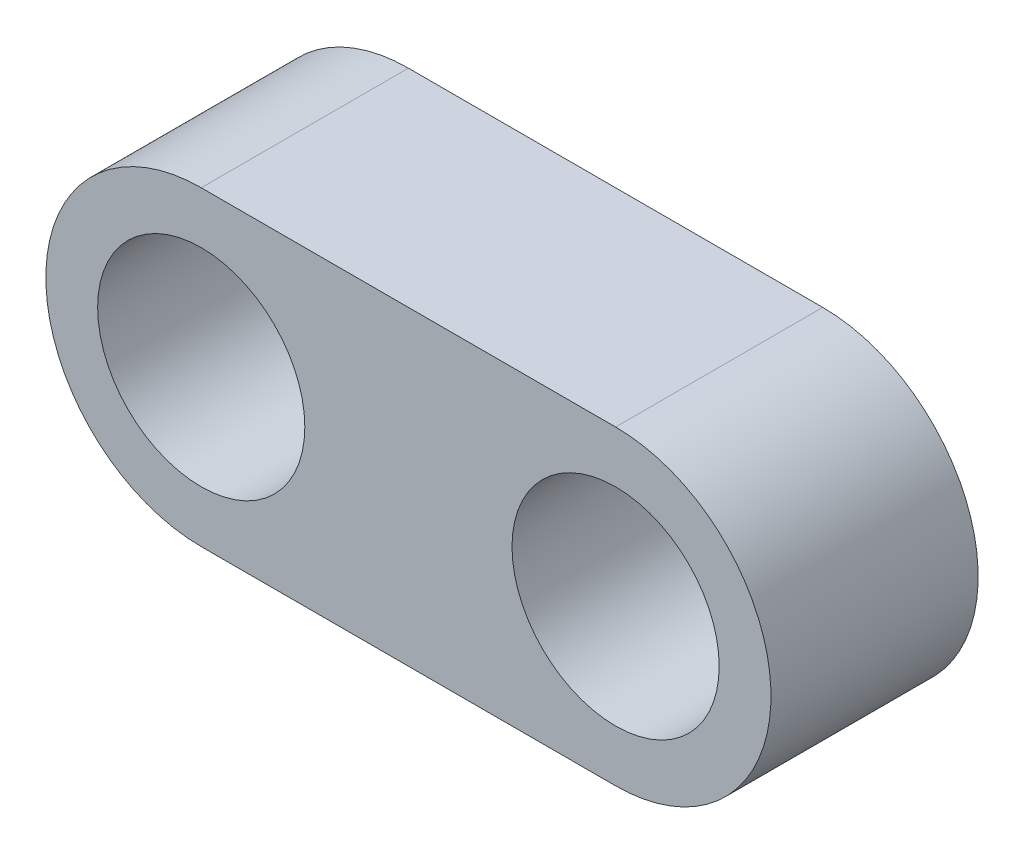
ISO-10303-21;
HEADER;
FILE_DESCRIPTION(('STEP AP214'),'2;1');
FILE_NAME('part.step','',(''),(''),'','','');
FILE_SCHEMA(('AUTOMOTIVE_DESIGN { 1 0 10303 214 1 1 1 1 }'));
ENDSEC;
DATA;
#1=APPLICATION_CONTEXT('core data for automotive mechanical design processes');
#2=APPLICATION_PROTOCOL_DEFINITION('international standard','automotive_design',2000,#1);
#3=PRODUCT_CONTEXT('',#1,'mechanical');
#4=PRODUCT('Part','Part','',(#3));
#5=PRODUCT_RELATED_PRODUCT_CATEGORY('part','',(#4));
#6=PRODUCT_DEFINITION_FORMATION('','',#4);
#7=PRODUCT_DEFINITION_CONTEXT('part definition',#1,'design');
#8=PRODUCT_DEFINITION('design','',#6,#7);
#9=PRODUCT_DEFINITION_SHAPE('','',#8);
#10=(LENGTH_UNIT() NAMED_UNIT(*) SI_UNIT(.MILLI.,.METRE.));
#11=(NAMED_UNIT(*) PLANE_ANGLE_UNIT() SI_UNIT($,.RADIAN.));
#12=(NAMED_UNIT(*) SI_UNIT($,.STERADIAN.) SOLID_ANGLE_UNIT());
#13=UNCERTAINTY_MEASURE_WITH_UNIT(LENGTH_MEASURE(1.E-05),#10,'distance_accuracy_value','');
#14=(GEOMETRIC_REPRESENTATION_CONTEXT(3) GLOBAL_UNCERTAINTY_ASSIGNED_CONTEXT((#13)) GLOBAL_UNIT_ASSIGNED_CONTEXT((#10,
#11,#12)) REPRESENTATION_CONTEXT('',''));
#15=CARTESIAN_POINT('',(0.,0.,0.));
#16=DIRECTION('',(0.,0.,1.));
#17=DIRECTION('',(1.,0.,0.));
#18=AXIS2_PLACEMENT_3D('',#15,#16,#17);
#19=CARTESIAN_POINT('',(-2.,0.,2.));
#20=DIRECTION('',(0.,0.,-1.));
#21=DIRECTION('',(-1.,0.,0.));
#22=AXIS2_PLACEMENT_3D('',#19,#20,#21);
#23=CYLINDRICAL_SURFACE('',#22,1.5);
#24=CARTESIAN_POINT('',(-2.,0.,0.));
#25=DIRECTION('',(0.,0.,1.));
#26=DIRECTION('',(1.,0.,0.));
#27=AXIS2_PLACEMENT_3D('',#24,#25,#26);
#28=CIRCLE('',#27,1.5);
#29=CARTESIAN_POINT('',(-2.,1.5,0.));
#30=VERTEX_POINT('',#29);
#31=CARTESIAN_POINT('',(-2.,-1.5,0.));
#32=VERTEX_POINT('',#31);
#33=EDGE_CURVE('E106',#30,#32,#28,.T.);
#34=ORIENTED_EDGE('',*,*,#33,.T.);
#35=DIRECTION('',(0.,0.,-1.));
#36=VECTOR('',#35,1.);
#37=CARTESIAN_POINT('',(-2.,-1.5,2.));
#38=LINE('',#37,#36);
#39=CARTESIAN_POINT('',(-2.,-1.5,2.));
#40=VERTEX_POINT('',#39);
#41=EDGE_CURVE('E11',#40,#32,#38,.T.);
#42=ORIENTED_EDGE('',*,*,#41,.F.);
#43=CARTESIAN_POINT('',(-2.,0.,2.));
#44=DIRECTION('',(0.,0.,1.));
#45=DIRECTION('',(1.,0.,0.));
#46=AXIS2_PLACEMENT_3D('',#43,#44,#45);
#47=CIRCLE('',#46,1.5);
#48=CARTESIAN_POINT('',(-2.,1.5,2.));
#49=VERTEX_POINT('',#48);
#50=EDGE_CURVE('E86',#49,#40,#47,.T.);
#51=ORIENTED_EDGE('',*,*,#50,.F.);
#52=DIRECTION('',(0.,0.,-1.));
#53=VECTOR('',#52,1.);
#54=CARTESIAN_POINT('',(-2.,1.5,2.));
#55=LINE('',#54,#53);
#56=EDGE_CURVE('E52',#49,#30,#55,.T.);
#57=ORIENTED_EDGE('',*,*,#56,.T.);
#58=EDGE_LOOP('',(#34,#42,#51,#57));
#59=FACE_BOUND('',#58,.T.);
#60=ADVANCED_FACE('F35',(#59),#23,.T.);
#61=CARTESIAN_POINT('',(0.,-1.5,2.));
#62=DIRECTION('',(0.,1.,0.));
#63=DIRECTION('',(0.,0.,1.));
#64=AXIS2_PLACEMENT_3D('',#61,#62,#63);
#65=PLANE('',#64);
#66=DIRECTION('',(1.,0.,0.));
#67=VECTOR('',#66,1.);
#68=CARTESIAN_POINT('',(0.,-1.5,0.));
#69=LINE('',#68,#67);
#70=CARTESIAN_POINT('',(2.,-1.5,0.));
#71=VERTEX_POINT('',#70);
#72=EDGE_CURVE('E91',#32,#71,#69,.T.);
#73=ORIENTED_EDGE('',*,*,#72,.T.);
#74=DIRECTION('',(0.,0.,-1.));
#75=VECTOR('',#74,1.);
#76=CARTESIAN_POINT('',(2.,-1.5,2.));
#77=LINE('',#76,#75);
#78=CARTESIAN_POINT('',(2.,-1.5,2.));
#79=VERTEX_POINT('',#78);
#80=EDGE_CURVE('E44',#79,#71,#77,.T.);
#81=ORIENTED_EDGE('',*,*,#80,.F.);
#82=DIRECTION('',(1.,0.,0.));
#83=VECTOR('',#82,1.);
#84=CARTESIAN_POINT('',(0.,-1.5,2.));
#85=LINE('',#84,#83);
#86=EDGE_CURVE('E78',#40,#79,#85,.T.);
#87=ORIENTED_EDGE('',*,*,#86,.F.);
#88=ORIENTED_EDGE('',*,*,#41,.T.);
#89=EDGE_LOOP('',(#73,#81,#87,#88));
#90=FACE_BOUND('',#89,.T.);
#91=ADVANCED_FACE('F90',(#90),#65,.F.);
#92=CARTESIAN_POINT('',(2.,0.,2.));
#93=DIRECTION('',(0.,0.,-1.));
#94=DIRECTION('',(-1.,0.,0.));
#95=AXIS2_PLACEMENT_3D('',#92,#93,#94);
#96=CYLINDRICAL_SURFACE('',#95,1.5);
#97=CARTESIAN_POINT('',(2.,0.,0.));
#98=DIRECTION('',(0.,0.,1.));
#99=DIRECTION('',(1.,0.,0.));
#100=AXIS2_PLACEMENT_3D('',#97,#98,#99);
#101=CIRCLE('',#100,1.5);
#102=CARTESIAN_POINT('',(2.,1.5,0.));
#103=VERTEX_POINT('',#102);
#104=EDGE_CURVE('E109',#71,#103,#101,.T.);
#105=ORIENTED_EDGE('',*,*,#104,.T.);
#106=DIRECTION('',(0.,0.,-1.));
#107=VECTOR('',#106,1.);
#108=CARTESIAN_POINT('',(2.,1.5,2.));
#109=LINE('',#108,#107);
#110=CARTESIAN_POINT('',(2.,1.5,2.));
#111=VERTEX_POINT('',#110);
#112=EDGE_CURVE('E67',#111,#103,#109,.T.);
#113=ORIENTED_EDGE('',*,*,#112,.F.);
#114=CARTESIAN_POINT('',(2.,0.,2.));
#115=DIRECTION('',(0.,0.,1.));
#116=DIRECTION('',(1.,0.,0.));
#117=AXIS2_PLACEMENT_3D('',#114,#115,#116);
#118=CIRCLE('',#117,1.5);
#119=EDGE_CURVE('E85',#79,#111,#118,.T.);
#120=ORIENTED_EDGE('',*,*,#119,.F.);
#121=ORIENTED_EDGE('',*,*,#80,.T.);
#122=EDGE_LOOP('',(#105,#113,#120,#121));
#123=FACE_BOUND('',#122,.T.);
#124=ADVANCED_FACE('F94',(#123),#96,.T.);
#125=CARTESIAN_POINT('',(0.,1.5,2.));
#126=DIRECTION('',(0.,1.,0.));
#127=DIRECTION('',(0.,0.,1.));
#128=AXIS2_PLACEMENT_3D('',#125,#126,#127);
#129=PLANE('',#128);
#130=DIRECTION('',(1.,0.,0.));
#131=VECTOR('',#130,1.);
#132=CARTESIAN_POINT('',(0.,1.5,0.));
#133=LINE('',#132,#131);
#134=EDGE_CURVE('E111',#30,#103,#133,.T.);
#135=ORIENTED_EDGE('',*,*,#134,.F.);
#136=ORIENTED_EDGE('',*,*,#56,.F.);
#137=DIRECTION('',(1.,0.,0.));
#138=VECTOR('',#137,1.);
#139=CARTESIAN_POINT('',(0.,1.5,2.));
#140=LINE('',#139,#138);
#141=EDGE_CURVE('E95',#49,#111,#140,.T.);
#142=ORIENTED_EDGE('',*,*,#141,.T.);
#143=ORIENTED_EDGE('',*,*,#112,.T.);
#144=EDGE_LOOP('',(#135,#136,#142,#143));
#145=FACE_BOUND('',#144,.T.);
#146=ADVANCED_FACE('F147',(#145),#129,.T.);
#147=CARTESIAN_POINT('',(-2.,0.,2.));
#148=DIRECTION('',(0.,0.,-1.));
#149=DIRECTION('',(-1.,0.,0.));
#150=AXIS2_PLACEMENT_3D('',#147,#148,#149);
#151=CYLINDRICAL_SURFACE('',#150,1.);
#152=CARTESIAN_POINT('',(-2.,0.,2.));
#153=DIRECTION('',(0.,0.,1.));
#154=DIRECTION('',(1.,0.,0.));
#155=AXIS2_PLACEMENT_3D('',#152,#153,#154);
#156=CIRCLE('',#155,1.);
#157=CARTESIAN_POINT('',(-1.,0.,2.));
#158=VERTEX_POINT('',#157);
#159=EDGE_CURVE('E117',#158,#158,#156,.T.);
#160=ORIENTED_EDGE('',*,*,#159,.T.);
#161=EDGE_LOOP('',(#160));
#162=FACE_BOUND('',#161,.T.);
#163=CARTESIAN_POINT('',(-2.,0.,0.));
#164=DIRECTION('',(0.,0.,1.));
#165=DIRECTION('',(1.,0.,0.));
#166=AXIS2_PLACEMENT_3D('',#163,#164,#165);
#167=CIRCLE('',#166,1.);
#168=CARTESIAN_POINT('',(-1.,0.,0.));
#169=VERTEX_POINT('',#168);
#170=EDGE_CURVE('E103',#169,#169,#167,.T.);
#171=ORIENTED_EDGE('',*,*,#170,.F.);
#172=EDGE_LOOP('',(#171));
#173=FACE_BOUND('',#172,.T.);
#174=ADVANCED_FACE('F37',(#162,#173),#151,.F.);
#175=CARTESIAN_POINT('',(2.,0.,2.));
#176=DIRECTION('',(0.,0.,-1.));
#177=DIRECTION('',(-1.,0.,0.));
#178=AXIS2_PLACEMENT_3D('',#175,#176,#177);
#179=CYLINDRICAL_SURFACE('',#178,1.);
#180=CARTESIAN_POINT('',(2.,0.,2.));
#181=DIRECTION('',(0.,0.,1.));
#182=DIRECTION('',(1.,0.,0.));
#183=AXIS2_PLACEMENT_3D('',#180,#181,#182);
#184=CIRCLE('',#183,1.);
#185=CARTESIAN_POINT('',(3.,0.,2.));
#186=VERTEX_POINT('',#185);
#187=EDGE_CURVE('E97',#186,#186,#184,.T.);
#188=ORIENTED_EDGE('',*,*,#187,.T.);
#189=EDGE_LOOP('',(#188));
#190=FACE_BOUND('',#189,.T.);
#191=CARTESIAN_POINT('',(2.,0.,0.));
#192=DIRECTION('',(0.,0.,1.));
#193=DIRECTION('',(1.,0.,0.));
#194=AXIS2_PLACEMENT_3D('',#191,#192,#193);
#195=CIRCLE('',#194,1.);
#196=CARTESIAN_POINT('',(3.,0.,0.));
#197=VERTEX_POINT('',#196);
#198=EDGE_CURVE('E114',#197,#197,#195,.T.);
#199=ORIENTED_EDGE('',*,*,#198,.F.);
#200=EDGE_LOOP('',(#199));
#201=FACE_BOUND('',#200,.T.);
#202=ADVANCED_FACE('F129',(#190,#201),#179,.F.);
#203=CARTESIAN_POINT('',(0.,0.,2.));
#204=DIRECTION('',(0.,0.,1.));
#205=DIRECTION('',(1.,0.,0.));
#206=AXIS2_PLACEMENT_3D('',#203,#204,#205);
#207=PLANE('',#206);
#208=ORIENTED_EDGE('',*,*,#159,.F.);
#209=EDGE_LOOP('',(#208));
#210=FACE_BOUND('',#209,.T.);
#211=ORIENTED_EDGE('',*,*,#50,.T.);
#212=ORIENTED_EDGE('',*,*,#86,.T.);
#213=ORIENTED_EDGE('',*,*,#119,.T.);
#214=ORIENTED_EDGE('',*,*,#141,.F.);
#215=EDGE_LOOP('',(#211,#212,#213,#214));
#216=FACE_BOUND('',#215,.T.);
#217=ORIENTED_EDGE('',*,*,#187,.F.);
#218=EDGE_LOOP('',(#217));
#219=FACE_BOUND('',#218,.T.);
#220=ADVANCED_FACE('F81',(#210,#216,#219),#207,.T.);
#221=CARTESIAN_POINT('',(0.,0.,0.));
#222=DIRECTION('',(0.,0.,1.));
#223=DIRECTION('',(1.,0.,0.));
#224=AXIS2_PLACEMENT_3D('',#221,#222,#223);
#225=PLANE('',#224);
#226=ORIENTED_EDGE('',*,*,#170,.T.);
#227=EDGE_LOOP('',(#226));
#228=FACE_BOUND('',#227,.T.);
#229=ORIENTED_EDGE('',*,*,#33,.F.);
#230=ORIENTED_EDGE('',*,*,#134,.T.);
#231=ORIENTED_EDGE('',*,*,#104,.F.);
#232=ORIENTED_EDGE('',*,*,#72,.F.);
#233=EDGE_LOOP('',(#229,#230,#231,#232));
#234=FACE_BOUND('',#233,.T.);
#235=ORIENTED_EDGE('',*,*,#198,.T.);
#236=EDGE_LOOP('',(#235));
#237=FACE_BOUND('',#236,.T.);
#238=ADVANCED_FACE('F128',(#228,#234,#237),#225,.F.);
#239=CLOSED_SHELL('',(#60,#91,#124,#146,#174,#202,#220,#238));
#240=MANIFOLD_SOLID_BREP('B2',#239);
#241=ADVANCED_BREP_SHAPE_REPRESENTATION('',(#18,#240),#14);
#242=SHAPE_DEFINITION_REPRESENTATION(#9,#241);
ENDSEC;
END-ISO-10303-21;
